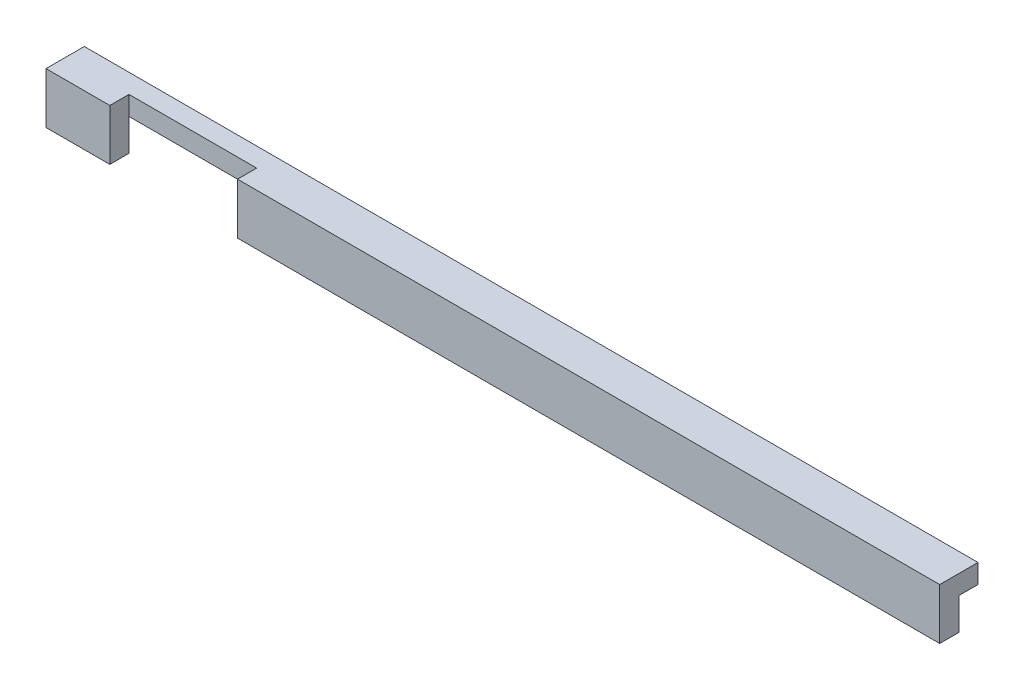
ISO-10303-21;
HEADER;
FILE_DESCRIPTION(('STEP AP214'),'2;1');
FILE_NAME('part.step','',(''),(''),'','','');
FILE_SCHEMA(('AUTOMOTIVE_DESIGN { 1 0 10303 214 1 1 1 1 }'));
ENDSEC;
DATA;
#1=APPLICATION_CONTEXT('core data for automotive mechanical design processes');
#2=APPLICATION_PROTOCOL_DEFINITION('international standard','automotive_design',2000,#1);
#3=PRODUCT_CONTEXT('',#1,'mechanical');
#4=PRODUCT('Part','Part','',(#3));
#5=PRODUCT_RELATED_PRODUCT_CATEGORY('part','',(#4));
#6=PRODUCT_DEFINITION_FORMATION('','',#4);
#7=PRODUCT_DEFINITION_CONTEXT('part definition',#1,'design');
#8=PRODUCT_DEFINITION('design','',#6,#7);
#9=PRODUCT_DEFINITION_SHAPE('','',#8);
#10=(LENGTH_UNIT() NAMED_UNIT(*) SI_UNIT(.MILLI.,.METRE.));
#11=(NAMED_UNIT(*) PLANE_ANGLE_UNIT() SI_UNIT($,.RADIAN.));
#12=(NAMED_UNIT(*) SI_UNIT($,.STERADIAN.) SOLID_ANGLE_UNIT());
#13=UNCERTAINTY_MEASURE_WITH_UNIT(LENGTH_MEASURE(1.E-05),#10,'distance_accuracy_value','');
#14=(GEOMETRIC_REPRESENTATION_CONTEXT(3) GLOBAL_UNCERTAINTY_ASSIGNED_CONTEXT((#13)) GLOBAL_UNIT_ASSIGNED_CONTEXT((#10,
#11,#12)) REPRESENTATION_CONTEXT('',''));
#15=CARTESIAN_POINT('',(0.,0.,0.));
#16=DIRECTION('',(0.,0.,1.));
#17=DIRECTION('',(1.,0.,0.));
#18=AXIS2_PLACEMENT_3D('',#15,#16,#17);
#19=CARTESIAN_POINT('',(0.,0.,0.));
#20=DIRECTION('',(0.,1.,0.));
#21=DIRECTION('',(0.,0.,1.));
#22=AXIS2_PLACEMENT_3D('',#19,#20,#21);
#23=PLANE('',#22);
#24=DIRECTION('',(1.,0.,0.));
#25=VECTOR('',#24,1.);
#26=CARTESIAN_POINT('',(-70.,0.,-1.00000000000001));
#27=LINE('',#26,#25);
#28=CARTESIAN_POINT('',(-70.,0.,-1.00000000000001));
#29=VERTEX_POINT('',#28);
#30=CARTESIAN_POINT('',(-60.,0.,-1.00000000000001));
#31=VERTEX_POINT('',#30);
#32=EDGE_CURVE('E136',#29,#31,#27,.T.);
#33=ORIENTED_EDGE('',*,*,#32,.T.);
#34=DIRECTION('',(0.,0.,1.));
#35=VECTOR('',#34,1.);
#36=CARTESIAN_POINT('',(-60.,0.,-1.00000000000001));
#37=LINE('',#36,#35);
#38=CARTESIAN_POINT('',(-60.,0.,1.99999999999999));
#39=VERTEX_POINT('',#38);
#40=EDGE_CURVE('E118',#31,#39,#37,.T.);
#41=ORIENTED_EDGE('',*,*,#40,.T.);
#42=DIRECTION('',(1.,0.,0.));
#43=VECTOR('',#42,1.);
#44=CARTESIAN_POINT('',(-70.,0.,1.99999999999999));
#45=LINE('',#44,#43);
#46=CARTESIAN_POINT('',(-70.,0.,1.99999999999999));
#47=VERTEX_POINT('',#46);
#48=EDGE_CURVE('E170',#47,#39,#45,.T.);
#49=ORIENTED_EDGE('',*,*,#48,.F.);
#50=DIRECTION('',(0.,0.,1.));
#51=VECTOR('',#50,1.);
#52=CARTESIAN_POINT('',(-70.,0.,4.00000000000001));
#53=LINE('',#52,#51);
#54=EDGE_CURVE('E143',#29,#47,#53,.T.);
#55=ORIENTED_EDGE('',*,*,#54,.F.);
#56=EDGE_LOOP('',(#33,#41,#49,#55));
#57=FACE_BOUND('',#56,.T.);
#58=ADVANCED_FACE('F34',(#57),#23,.F.);
#59=CARTESIAN_POINT('',(-70.,0.,1.99999999999999));
#60=DIRECTION('',(0.,0.,-1.));
#61=DIRECTION('',(-1.,0.,0.));
#62=AXIS2_PLACEMENT_3D('',#59,#60,#61);
#63=PLANE('',#62);
#64=ORIENTED_EDGE('',*,*,#48,.T.);
#65=DIRECTION('',(0.,-1.,0.));
#66=VECTOR('',#65,1.);
#67=CARTESIAN_POINT('',(-60.,8.,1.99999999999999));
#68=LINE('',#67,#66);
#69=CARTESIAN_POINT('',(-60.,8.,1.99999999999999));
#70=VERTEX_POINT('',#69);
#71=EDGE_CURVE('E124',#70,#39,#68,.T.);
#72=ORIENTED_EDGE('',*,*,#71,.F.);
#73=DIRECTION('',(1.,0.,0.));
#74=VECTOR('',#73,1.);
#75=CARTESIAN_POINT('',(-70.,8.,1.99999999999999));
#76=LINE('',#75,#74);
#77=CARTESIAN_POINT('',(-70.,8.,1.99999999999999));
#78=VERTEX_POINT('',#77);
#79=EDGE_CURVE('E165',#78,#70,#76,.T.);
#80=ORIENTED_EDGE('',*,*,#79,.F.);
#81=DIRECTION('',(0.,1.,0.));
#82=VECTOR('',#81,1.);
#83=CARTESIAN_POINT('',(-70.,0.,1.99999999999999));
#84=LINE('',#83,#82);
#85=EDGE_CURVE('E157',#47,#78,#84,.T.);
#86=ORIENTED_EDGE('',*,*,#85,.F.);
#87=EDGE_LOOP('',(#64,#72,#80,#86));
#88=FACE_BOUND('',#87,.T.);
#89=ADVANCED_FACE('F226',(#88),#63,.F.);
#90=CARTESIAN_POINT('',(-70.,0.,-1.00000000000001));
#91=DIRECTION('',(0.,0.,1.));
#92=DIRECTION('',(1.,0.,0.));
#93=AXIS2_PLACEMENT_3D('',#90,#91,#92);
#94=PLANE('',#93);
#95=DIRECTION('',(1.,0.,0.));
#96=VECTOR('',#95,1.);
#97=CARTESIAN_POINT('',(-70.,5.,-1.00000000000001));
#98=LINE('',#97,#96);
#99=CARTESIAN_POINT('',(-70.,5.,-1.00000000000001));
#100=VERTEX_POINT('',#99);
#101=CARTESIAN_POINT('',(-60.,5.,-1.00000000000001));
#102=VERTEX_POINT('',#101);
#103=EDGE_CURVE('E138',#100,#102,#98,.T.);
#104=ORIENTED_EDGE('',*,*,#103,.T.);
#105=DIRECTION('',(0.,-1.,0.));
#106=VECTOR('',#105,1.);
#107=CARTESIAN_POINT('',(-60.,8.,-1.00000000000001));
#108=LINE('',#107,#106);
#109=EDGE_CURVE('E121',#102,#31,#108,.T.);
#110=ORIENTED_EDGE('',*,*,#109,.T.);
#111=ORIENTED_EDGE('',*,*,#32,.F.);
#112=DIRECTION('',(0.,-1.,0.));
#113=VECTOR('',#112,1.);
#114=CARTESIAN_POINT('',(-70.,0.,-1.00000000000001));
#115=LINE('',#114,#113);
#116=EDGE_CURVE('E156',#100,#29,#115,.T.);
#117=ORIENTED_EDGE('',*,*,#116,.F.);
#118=EDGE_LOOP('',(#104,#110,#111,#117));
#119=FACE_BOUND('',#118,.T.);
#120=ADVANCED_FACE('F134',(#119),#94,.F.);
#121=CARTESIAN_POINT('',(-70.,8.,4.00000000000001));
#122=DIRECTION('',(1.,0.,0.));
#123=DIRECTION('',(0.,0.,-1.));
#124=AXIS2_PLACEMENT_3D('',#121,#122,#123);
#125=PLANE('',#124);
#126=DIRECTION('',(0.,0.,1.));
#127=VECTOR('',#126,1.);
#128=CARTESIAN_POINT('',(-70.,5.,-4.00000000000001));
#129=LINE('',#128,#127);
#130=CARTESIAN_POINT('',(-70.,5.,-4.00000000000001));
#131=VERTEX_POINT('',#130);
#132=EDGE_CURVE('E185',#131,#100,#129,.T.);
#133=ORIENTED_EDGE('',*,*,#132,.T.);
#134=ORIENTED_EDGE('',*,*,#116,.T.);
#135=ORIENTED_EDGE('',*,*,#54,.T.);
#136=ORIENTED_EDGE('',*,*,#85,.T.);
#137=DIRECTION('',(0.,0.,1.));
#138=VECTOR('',#137,1.);
#139=CARTESIAN_POINT('',(-70.,8.,4.00000000000001));
#140=LINE('',#139,#138);
#141=CARTESIAN_POINT('',(-70.,8.,-3.99999999999999));
#142=VERTEX_POINT('',#141);
#143=EDGE_CURVE('E172',#142,#78,#140,.T.);
#144=ORIENTED_EDGE('',*,*,#143,.F.);
#145=DIRECTION('',(0.,-1.,0.));
#146=VECTOR('',#145,1.);
#147=CARTESIAN_POINT('',(-70.,8.,-3.99999999999999));
#148=LINE('',#147,#146);
#149=EDGE_CURVE('E42',#142,#131,#148,.T.);
#150=ORIENTED_EDGE('',*,*,#149,.T.);
#151=EDGE_LOOP('',(#133,#134,#135,#136,#144,#150));
#152=FACE_BOUND('',#151,.T.);
#153=ADVANCED_FACE('F36',(#152),#125,.F.);
#154=CARTESIAN_POINT('',(70.,8.,3.99999999999999));
#155=DIRECTION('',(-1.,0.,0.));
#156=DIRECTION('',(0.,0.,1.));
#157=AXIS2_PLACEMENT_3D('',#154,#155,#156);
#158=PLANE('',#157);
#159=DIRECTION('',(0.,0.,-1.));
#160=VECTOR('',#159,1.);
#161=CARTESIAN_POINT('',(70.,0.,3.99999999999999));
#162=LINE('',#161,#160);
#163=CARTESIAN_POINT('',(70.,0.,1.99999999999999));
#164=VERTEX_POINT('',#163);
#165=CARTESIAN_POINT('',(70.,0.,-1.00000000000001));
#166=VERTEX_POINT('',#165);
#167=EDGE_CURVE('E145',#164,#166,#162,.T.);
#168=ORIENTED_EDGE('',*,*,#167,.T.);
#169=DIRECTION('',(0.,-1.,0.));
#170=VECTOR('',#169,1.);
#171=CARTESIAN_POINT('',(70.,0.,-1.00000000000001));
#172=LINE('',#171,#170);
#173=CARTESIAN_POINT('',(70.,5.,-1.00000000000001));
#174=VERTEX_POINT('',#173);
#175=EDGE_CURVE('E149',#174,#166,#172,.T.);
#176=ORIENTED_EDGE('',*,*,#175,.F.);
#177=DIRECTION('',(0.,0.,1.));
#178=VECTOR('',#177,1.);
#179=CARTESIAN_POINT('',(70.,5.,-4.00000000000001));
#180=LINE('',#179,#178);
#181=CARTESIAN_POINT('',(70.,5.,-4.00000000000001));
#182=VERTEX_POINT('',#181);
#183=EDGE_CURVE('E168',#182,#174,#180,.T.);
#184=ORIENTED_EDGE('',*,*,#183,.F.);
#185=DIRECTION('',(0.,-1.,0.));
#186=VECTOR('',#185,1.);
#187=CARTESIAN_POINT('',(70.,8.,-4.00000000000001));
#188=LINE('',#187,#186);
#189=CARTESIAN_POINT('',(70.,8.,-4.00000000000001));
#190=VERTEX_POINT('',#189);
#191=EDGE_CURVE('E11',#190,#182,#188,.T.);
#192=ORIENTED_EDGE('',*,*,#191,.F.);
#193=DIRECTION('',(0.,0.,-1.));
#194=VECTOR('',#193,1.);
#195=CARTESIAN_POINT('',(70.,8.,3.99999999999999));
#196=LINE('',#195,#194);
#197=CARTESIAN_POINT('',(70.,8.,1.99999999999999));
#198=VERTEX_POINT('',#197);
#199=EDGE_CURVE('E175',#198,#190,#196,.T.);
#200=ORIENTED_EDGE('',*,*,#199,.F.);
#201=DIRECTION('',(0.,1.,0.));
#202=VECTOR('',#201,1.);
#203=CARTESIAN_POINT('',(70.,0.,1.99999999999999));
#204=LINE('',#203,#202);
#205=EDGE_CURVE('E161',#164,#198,#204,.T.);
#206=ORIENTED_EDGE('',*,*,#205,.F.);
#207=EDGE_LOOP('',(#168,#176,#184,#192,#200,#206));
#208=FACE_BOUND('',#207,.T.);
#209=ADVANCED_FACE('F198',(#208),#158,.F.);
#210=CARTESIAN_POINT('',(70.,8.,-4.00000000000001));
#211=DIRECTION('',(0.,0.,1.));
#212=DIRECTION('',(1.,0.,0.));
#213=AXIS2_PLACEMENT_3D('',#210,#211,#212);
#214=PLANE('',#213);
#215=ORIENTED_EDGE('',*,*,#191,.T.);
#216=DIRECTION('',(1.,0.,0.));
#217=VECTOR('',#216,1.);
#218=CARTESIAN_POINT('',(-70.,5.,-4.00000000000001));
#219=LINE('',#218,#217);
#220=EDGE_CURVE('E154',#131,#182,#219,.T.);
#221=ORIENTED_EDGE('',*,*,#220,.F.);
#222=ORIENTED_EDGE('',*,*,#149,.F.);
#223=DIRECTION('',(-1.,0.,0.));
#224=VECTOR('',#223,1.);
#225=CARTESIAN_POINT('',(70.,8.,-4.00000000000001));
#226=LINE('',#225,#224);
#227=EDGE_CURVE('E177',#190,#142,#226,.T.);
#228=ORIENTED_EDGE('',*,*,#227,.F.);
#229=EDGE_LOOP('',(#215,#221,#222,#228));
#230=FACE_BOUND('',#229,.T.);
#231=ADVANCED_FACE('F189',(#230),#214,.F.);
#232=CARTESIAN_POINT('',(0.,8.,0.));
#233=DIRECTION('',(0.,1.,0.));
#234=DIRECTION('',(0.,0.,1.));
#235=AXIS2_PLACEMENT_3D('',#232,#233,#234);
#236=PLANE('',#235);
#237=DIRECTION('',(0.,0.,1.));
#238=VECTOR('',#237,1.);
#239=CARTESIAN_POINT('',(-60.,8.,-1.00000000000001));
#240=LINE('',#239,#238);
#241=CARTESIAN_POINT('',(-60.,8.,-1.00000000000001));
#242=VERTEX_POINT('',#241);
#243=EDGE_CURVE('E164',#242,#70,#240,.T.);
#244=ORIENTED_EDGE('',*,*,#243,.F.);
#245=DIRECTION('',(-1.,0.,0.));
#246=VECTOR('',#245,1.);
#247=CARTESIAN_POINT('',(-60.,8.,-1.00000000000001));
#248=LINE('',#247,#246);
#249=CARTESIAN_POINT('',(-40.,8.,-1.00000000000001));
#250=VERTEX_POINT('',#249);
#251=EDGE_CURVE('E130',#250,#242,#248,.T.);
#252=ORIENTED_EDGE('',*,*,#251,.F.);
#253=DIRECTION('',(0.,0.,1.));
#254=VECTOR('',#253,1.);
#255=CARTESIAN_POINT('',(-40.,8.,-1.00000000000001));
#256=LINE('',#255,#254);
#257=CARTESIAN_POINT('',(-40.,8.,1.99999999999999));
#258=VERTEX_POINT('',#257);
#259=EDGE_CURVE('E204',#250,#258,#256,.T.);
#260=ORIENTED_EDGE('',*,*,#259,.T.);
#261=EDGE_CURVE('E169',#258,#198,#76,.T.);
#262=ORIENTED_EDGE('',*,*,#261,.T.);
#263=ORIENTED_EDGE('',*,*,#199,.T.);
#264=ORIENTED_EDGE('',*,*,#227,.T.);
#265=ORIENTED_EDGE('',*,*,#143,.T.);
#266=ORIENTED_EDGE('',*,*,#79,.T.);
#267=EDGE_LOOP('',(#244,#252,#260,#262,#263,#264,#265,#266));
#268=FACE_BOUND('',#267,.T.);
#269=ADVANCED_FACE('F224',(#268),#236,.T.);
#270=CARTESIAN_POINT('',(-40.,0.,1.99999999999999));
#271=VERTEX_POINT('',#270);
#272=EDGE_CURVE('E160',#271,#164,#45,.T.);
#273=ORIENTED_EDGE('',*,*,#272,.F.);
#274=DIRECTION('',(0.,0.,1.));
#275=VECTOR('',#274,1.);
#276=CARTESIAN_POINT('',(-40.,0.,-1.00000000000001));
#277=LINE('',#276,#275);
#278=CARTESIAN_POINT('',(-40.,0.,-1.00000000000001));
#279=VERTEX_POINT('',#278);
#280=EDGE_CURVE('E129',#279,#271,#277,.T.);
#281=ORIENTED_EDGE('',*,*,#280,.F.);
#282=EDGE_CURVE('E57',#279,#166,#27,.T.);
#283=ORIENTED_EDGE('',*,*,#282,.T.);
#284=ORIENTED_EDGE('',*,*,#167,.F.);
#285=EDGE_LOOP('',(#273,#281,#283,#284));
#286=FACE_BOUND('',#285,.T.);
#287=ADVANCED_FACE('F230',(#286),#23,.F.);
#288=ORIENTED_EDGE('',*,*,#261,.F.);
#289=DIRECTION('',(0.,1.,0.));
#290=VECTOR('',#289,1.);
#291=CARTESIAN_POINT('',(-40.,8.,1.99999999999999));
#292=LINE('',#291,#290);
#293=EDGE_CURVE('E139',#271,#258,#292,.T.);
#294=ORIENTED_EDGE('',*,*,#293,.F.);
#295=ORIENTED_EDGE('',*,*,#272,.T.);
#296=ORIENTED_EDGE('',*,*,#205,.T.);
#297=EDGE_LOOP('',(#288,#294,#295,#296));
#298=FACE_BOUND('',#297,.T.);
#299=ADVANCED_FACE('F231',(#298),#63,.F.);
#300=ORIENTED_EDGE('',*,*,#282,.F.);
#301=DIRECTION('',(0.,1.,0.));
#302=VECTOR('',#301,1.);
#303=CARTESIAN_POINT('',(-40.,8.,-1.00000000000001));
#304=LINE('',#303,#302);
#305=CARTESIAN_POINT('',(-40.,5.,-1.00000000000001));
#306=VERTEX_POINT('',#305);
#307=EDGE_CURVE('E211',#279,#306,#304,.T.);
#308=ORIENTED_EDGE('',*,*,#307,.T.);
#309=EDGE_CURVE('E153',#306,#174,#98,.T.);
#310=ORIENTED_EDGE('',*,*,#309,.T.);
#311=ORIENTED_EDGE('',*,*,#175,.T.);
#312=EDGE_LOOP('',(#300,#308,#310,#311));
#313=FACE_BOUND('',#312,.T.);
#314=ADVANCED_FACE('F233',(#313),#94,.F.);
#315=CARTESIAN_POINT('',(-70.,5.,-4.00000000000001));
#316=DIRECTION('',(0.,1.,0.));
#317=DIRECTION('',(0.,0.,1.));
#318=AXIS2_PLACEMENT_3D('',#315,#316,#317);
#319=PLANE('',#318);
#320=ORIENTED_EDGE('',*,*,#183,.T.);
#321=ORIENTED_EDGE('',*,*,#309,.F.);
#322=EDGE_CURVE('E152',#102,#306,#98,.T.);
#323=ORIENTED_EDGE('',*,*,#322,.F.);
#324=ORIENTED_EDGE('',*,*,#103,.F.);
#325=ORIENTED_EDGE('',*,*,#132,.F.);
#326=ORIENTED_EDGE('',*,*,#220,.T.);
#327=EDGE_LOOP('',(#320,#321,#323,#324,#325,#326));
#328=FACE_BOUND('',#327,.T.);
#329=ADVANCED_FACE('F194',(#328),#319,.F.);
#330=CARTESIAN_POINT('',(0.,0.,-1.00000000000001));
#331=DIRECTION('',(0.,0.,1.));
#332=DIRECTION('',(1.,0.,0.));
#333=AXIS2_PLACEMENT_3D('',#330,#331,#332);
#334=PLANE('',#333);
#335=ORIENTED_EDGE('',*,*,#322,.T.);
#336=EDGE_CURVE('E213',#306,#250,#304,.T.);
#337=ORIENTED_EDGE('',*,*,#336,.T.);
#338=ORIENTED_EDGE('',*,*,#251,.T.);
#339=EDGE_CURVE('E49',#242,#102,#108,.T.);
#340=ORIENTED_EDGE('',*,*,#339,.T.);
#341=EDGE_LOOP('',(#335,#337,#338,#340));
#342=FACE_BOUND('',#341,.T.);
#343=ADVANCED_FACE('F216',(#342),#334,.T.);
#344=CARTESIAN_POINT('',(-60.,8.,-1.00000000000001));
#345=DIRECTION('',(-1.,0.,0.));
#346=DIRECTION('',(0.,0.,1.));
#347=AXIS2_PLACEMENT_3D('',#344,#345,#346);
#348=PLANE('',#347);
#349=ORIENTED_EDGE('',*,*,#71,.T.);
#350=ORIENTED_EDGE('',*,*,#40,.F.);
#351=ORIENTED_EDGE('',*,*,#109,.F.);
#352=ORIENTED_EDGE('',*,*,#339,.F.);
#353=ORIENTED_EDGE('',*,*,#243,.T.);
#354=EDGE_LOOP('',(#349,#350,#351,#352,#353));
#355=FACE_BOUND('',#354,.T.);
#356=ADVANCED_FACE('F120',(#355),#348,.F.);
#357=CARTESIAN_POINT('',(-40.,8.,-1.00000000000001));
#358=DIRECTION('',(1.,0.,0.));
#359=DIRECTION('',(0.,0.,-1.));
#360=AXIS2_PLACEMENT_3D('',#357,#358,#359);
#361=PLANE('',#360);
#362=ORIENTED_EDGE('',*,*,#293,.T.);
#363=ORIENTED_EDGE('',*,*,#259,.F.);
#364=ORIENTED_EDGE('',*,*,#336,.F.);
#365=ORIENTED_EDGE('',*,*,#307,.F.);
#366=ORIENTED_EDGE('',*,*,#280,.T.);
#367=EDGE_LOOP('',(#362,#363,#364,#365,#366));
#368=FACE_BOUND('',#367,.T.);
#369=ADVANCED_FACE('F220',(#368),#361,.F.);
#370=CLOSED_SHELL('',(#58,#89,#120,#153,#209,#231,#269,#287,#299,#314,#329,#343,#356,#369));
#371=MANIFOLD_SOLID_BREP('B2',#370);
#372=ADVANCED_BREP_SHAPE_REPRESENTATION('',(#18,#371),#14);
#373=SHAPE_DEFINITION_REPRESENTATION(#9,#372);
ENDSEC;
END-ISO-10303-21;
